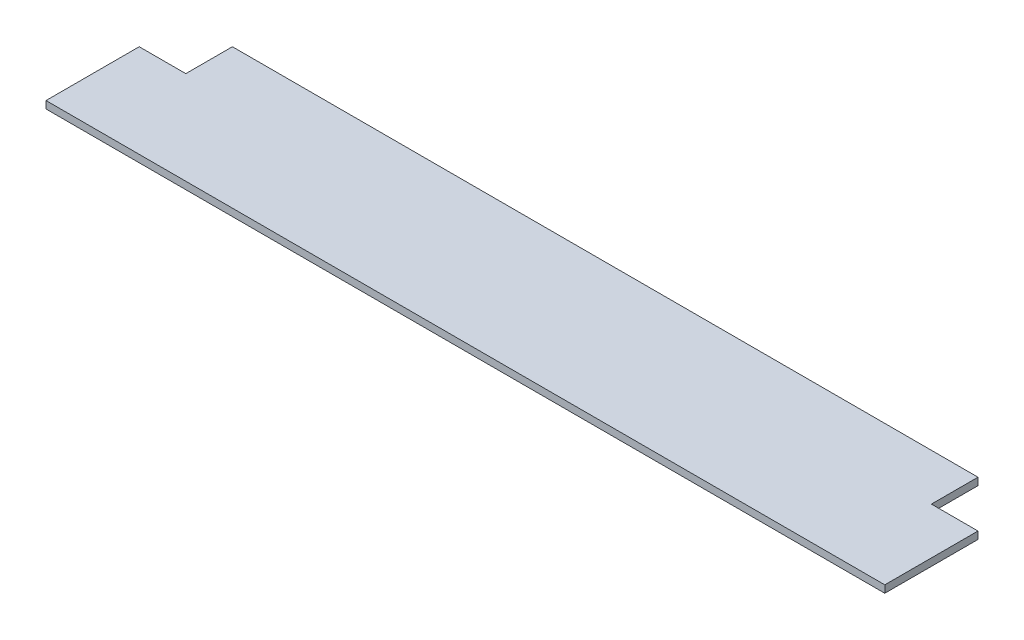
ISO-10303-21;
HEADER;
FILE_DESCRIPTION(('STEP AP214'),'2;1');
FILE_NAME('part.step','',(''),(''),'','','');
FILE_SCHEMA(('AUTOMOTIVE_DESIGN { 1 0 10303 214 1 1 1 1 }'));
ENDSEC;
DATA;
#1=APPLICATION_CONTEXT('core data for automotive mechanical design processes');
#2=APPLICATION_PROTOCOL_DEFINITION('international standard','automotive_design',2000,#1);
#3=PRODUCT_CONTEXT('',#1,'mechanical');
#4=PRODUCT('Part','Part','',(#3));
#5=PRODUCT_RELATED_PRODUCT_CATEGORY('part','',(#4));
#6=PRODUCT_DEFINITION_FORMATION('','',#4);
#7=PRODUCT_DEFINITION_CONTEXT('part definition',#1,'design');
#8=PRODUCT_DEFINITION('design','',#6,#7);
#9=PRODUCT_DEFINITION_SHAPE('','',#8);
#10=(LENGTH_UNIT() NAMED_UNIT(*) SI_UNIT(.MILLI.,.METRE.));
#11=(NAMED_UNIT(*) PLANE_ANGLE_UNIT() SI_UNIT($,.RADIAN.));
#12=(NAMED_UNIT(*) SI_UNIT($,.STERADIAN.) SOLID_ANGLE_UNIT());
#13=UNCERTAINTY_MEASURE_WITH_UNIT(LENGTH_MEASURE(1.E-05),#10,'distance_accuracy_value','');
#14=(GEOMETRIC_REPRESENTATION_CONTEXT(3) GLOBAL_UNCERTAINTY_ASSIGNED_CONTEXT((#13)) GLOBAL_UNIT_ASSIGNED_CONTEXT((#10,
#11,#12)) REPRESENTATION_CONTEXT('',''));
#15=CARTESIAN_POINT('',(0.,0.,0.));
#16=DIRECTION('',(0.,0.,1.));
#17=DIRECTION('',(1.,0.,0.));
#18=AXIS2_PLACEMENT_3D('',#15,#16,#17);
#19=CARTESIAN_POINT('',(50.8,1.,-6.35));
#20=DIRECTION('',(0.,0.,1.));
#21=DIRECTION('',(1.,0.,0.));
#22=AXIS2_PLACEMENT_3D('',#19,#20,#21);
#23=PLANE('',#22);
#24=DIRECTION('',(-1.,0.,0.));
#25=VECTOR('',#24,1.);
#26=CARTESIAN_POINT('',(50.8,0.,-6.35));
#27=LINE('',#26,#25);
#28=CARTESIAN_POINT('',(57.15,0.,-6.35));
#29=VERTEX_POINT('',#28);
#30=CARTESIAN_POINT('',(50.8,0.,-6.35));
#31=VERTEX_POINT('',#30);
#32=EDGE_CURVE('E135',#29,#31,#27,.T.);
#33=ORIENTED_EDGE('',*,*,#32,.T.);
#34=DIRECTION('',(0.,-1.,0.));
#35=VECTOR('',#34,1.);
#36=CARTESIAN_POINT('',(50.8,1.,-6.35));
#37=LINE('',#36,#35);
#38=CARTESIAN_POINT('',(50.8,1.,-6.35));
#39=VERTEX_POINT('',#38);
#40=EDGE_CURVE('E11',#39,#31,#37,.T.);
#41=ORIENTED_EDGE('',*,*,#40,.F.);
#42=DIRECTION('',(-1.,0.,0.));
#43=VECTOR('',#42,1.);
#44=CARTESIAN_POINT('',(50.8,1.,-6.35));
#45=LINE('',#44,#43);
#46=CARTESIAN_POINT('',(57.15,1.,-6.35));
#47=VERTEX_POINT('',#46);
#48=EDGE_CURVE('E149',#47,#39,#45,.T.);
#49=ORIENTED_EDGE('',*,*,#48,.F.);
#50=DIRECTION('',(0.,-1.,0.));
#51=VECTOR('',#50,1.);
#52=CARTESIAN_POINT('',(57.15,1.,-6.35));
#53=LINE('',#52,#51);
#54=EDGE_CURVE('E131',#47,#29,#53,.T.);
#55=ORIENTED_EDGE('',*,*,#54,.T.);
#56=EDGE_LOOP('',(#33,#41,#49,#55));
#57=FACE_BOUND('',#56,.T.);
#58=ADVANCED_FACE('F39',(#57),#23,.F.);
#59=CARTESIAN_POINT('',(50.8,1.,-12.7));
#60=DIRECTION('',(-1.,0.,0.));
#61=DIRECTION('',(0.,0.,1.));
#62=AXIS2_PLACEMENT_3D('',#59,#60,#61);
#63=PLANE('',#62);
#64=DIRECTION('',(0.,0.,-1.));
#65=VECTOR('',#64,1.);
#66=CARTESIAN_POINT('',(50.8,0.,-12.7));
#67=LINE('',#66,#65);
#68=CARTESIAN_POINT('',(50.8,0.,-12.7));
#69=VERTEX_POINT('',#68);
#70=EDGE_CURVE('E138',#31,#69,#67,.T.);
#71=ORIENTED_EDGE('',*,*,#70,.T.);
#72=DIRECTION('',(0.,-1.,0.));
#73=VECTOR('',#72,1.);
#74=CARTESIAN_POINT('',(50.8,1.,-12.7));
#75=LINE('',#74,#73);
#76=CARTESIAN_POINT('',(50.8,1.,-12.7));
#77=VERTEX_POINT('',#76);
#78=EDGE_CURVE('E47',#77,#69,#75,.T.);
#79=ORIENTED_EDGE('',*,*,#78,.F.);
#80=DIRECTION('',(0.,0.,-1.));
#81=VECTOR('',#80,1.);
#82=CARTESIAN_POINT('',(50.8,1.,-12.7));
#83=LINE('',#82,#81);
#84=EDGE_CURVE('E98',#39,#77,#83,.T.);
#85=ORIENTED_EDGE('',*,*,#84,.F.);
#86=ORIENTED_EDGE('',*,*,#40,.T.);
#87=EDGE_LOOP('',(#71,#79,#85,#86));
#88=FACE_BOUND('',#87,.T.);
#89=ADVANCED_FACE('F184',(#88),#63,.F.);
#90=CARTESIAN_POINT('',(-50.8,1.,-12.7));
#91=DIRECTION('',(0.,0.,1.));
#92=DIRECTION('',(1.,0.,0.));
#93=AXIS2_PLACEMENT_3D('',#90,#91,#92);
#94=PLANE('',#93);
#95=DIRECTION('',(-1.,0.,0.));
#96=VECTOR('',#95,1.);
#97=CARTESIAN_POINT('',(-50.8,0.,-12.7));
#98=LINE('',#97,#96);
#99=CARTESIAN_POINT('',(-50.8,0.,-12.7));
#100=VERTEX_POINT('',#99);
#101=EDGE_CURVE('E140',#69,#100,#98,.T.);
#102=ORIENTED_EDGE('',*,*,#101,.T.);
#103=DIRECTION('',(0.,-1.,0.));
#104=VECTOR('',#103,1.);
#105=CARTESIAN_POINT('',(-50.8,1.,-12.7));
#106=LINE('',#105,#104);
#107=CARTESIAN_POINT('',(-50.8,1.,-12.7));
#108=VERTEX_POINT('',#107);
#109=EDGE_CURVE('E156',#108,#100,#106,.T.);
#110=ORIENTED_EDGE('',*,*,#109,.F.);
#111=DIRECTION('',(-1.,0.,0.));
#112=VECTOR('',#111,1.);
#113=CARTESIAN_POINT('',(-50.8,1.,-12.7));
#114=LINE('',#113,#112);
#115=EDGE_CURVE('E164',#77,#108,#114,.T.);
#116=ORIENTED_EDGE('',*,*,#115,.F.);
#117=ORIENTED_EDGE('',*,*,#78,.T.);
#118=EDGE_LOOP('',(#102,#110,#116,#117));
#119=FACE_BOUND('',#118,.T.);
#120=ADVANCED_FACE('F162',(#119),#94,.F.);
#121=CARTESIAN_POINT('',(-50.8,1.,-6.35));
#122=DIRECTION('',(1.,0.,0.));
#123=DIRECTION('',(0.,0.,-1.));
#124=AXIS2_PLACEMENT_3D('',#121,#122,#123);
#125=PLANE('',#124);
#126=DIRECTION('',(0.,0.,1.));
#127=VECTOR('',#126,1.);
#128=CARTESIAN_POINT('',(-50.8,0.,-6.35));
#129=LINE('',#128,#127);
#130=CARTESIAN_POINT('',(-50.8,0.,-6.35));
#131=VERTEX_POINT('',#130);
#132=EDGE_CURVE('E142',#100,#131,#129,.T.);
#133=ORIENTED_EDGE('',*,*,#132,.T.);
#134=DIRECTION('',(0.,-1.,0.));
#135=VECTOR('',#134,1.);
#136=CARTESIAN_POINT('',(-50.8,1.,-6.35));
#137=LINE('',#136,#135);
#138=CARTESIAN_POINT('',(-50.8,1.,-6.35));
#139=VERTEX_POINT('',#138);
#140=EDGE_CURVE('E153',#139,#131,#137,.T.);
#141=ORIENTED_EDGE('',*,*,#140,.F.);
#142=DIRECTION('',(0.,0.,1.));
#143=VECTOR('',#142,1.);
#144=CARTESIAN_POINT('',(-50.8,1.,-6.35));
#145=LINE('',#144,#143);
#146=EDGE_CURVE('E176',#108,#139,#145,.T.);
#147=ORIENTED_EDGE('',*,*,#146,.F.);
#148=ORIENTED_EDGE('',*,*,#109,.T.);
#149=EDGE_LOOP('',(#133,#141,#147,#148));
#150=FACE_BOUND('',#149,.T.);
#151=ADVANCED_FACE('F172',(#150),#125,.F.);
#152=CARTESIAN_POINT('',(-57.15,1.,-6.35));
#153=DIRECTION('',(0.,0.,1.));
#154=DIRECTION('',(1.,0.,0.));
#155=AXIS2_PLACEMENT_3D('',#152,#153,#154);
#156=PLANE('',#155);
#157=DIRECTION('',(-1.,0.,0.));
#158=VECTOR('',#157,1.);
#159=CARTESIAN_POINT('',(-57.15,0.,-6.35));
#160=LINE('',#159,#158);
#161=CARTESIAN_POINT('',(-57.15,0.,-6.35));
#162=VERTEX_POINT('',#161);
#163=EDGE_CURVE('E144',#131,#162,#160,.T.);
#164=ORIENTED_EDGE('',*,*,#163,.T.);
#165=DIRECTION('',(0.,-1.,0.));
#166=VECTOR('',#165,1.);
#167=CARTESIAN_POINT('',(-57.15,1.,-6.35));
#168=LINE('',#167,#166);
#169=CARTESIAN_POINT('',(-57.15,1.,-6.35));
#170=VERTEX_POINT('',#169);
#171=EDGE_CURVE('E126',#170,#162,#168,.T.);
#172=ORIENTED_EDGE('',*,*,#171,.F.);
#173=DIRECTION('',(-1.,0.,0.));
#174=VECTOR('',#173,1.);
#175=CARTESIAN_POINT('',(-57.15,1.,-6.35));
#176=LINE('',#175,#174);
#177=EDGE_CURVE('E117',#139,#170,#176,.T.);
#178=ORIENTED_EDGE('',*,*,#177,.F.);
#179=ORIENTED_EDGE('',*,*,#140,.T.);
#180=EDGE_LOOP('',(#164,#172,#178,#179));
#181=FACE_BOUND('',#180,.T.);
#182=ADVANCED_FACE('F175',(#181),#156,.F.);
#183=CARTESIAN_POINT('',(-57.15,1.,6.35));
#184=DIRECTION('',(1.,0.,0.));
#185=DIRECTION('',(0.,0.,-1.));
#186=AXIS2_PLACEMENT_3D('',#183,#184,#185);
#187=PLANE('',#186);
#188=DIRECTION('',(0.,0.,1.));
#189=VECTOR('',#188,1.);
#190=CARTESIAN_POINT('',(-57.15,0.,6.35));
#191=LINE('',#190,#189);
#192=CARTESIAN_POINT('',(-57.15,0.,6.35));
#193=VERTEX_POINT('',#192);
#194=EDGE_CURVE('E125',#162,#193,#191,.T.);
#195=ORIENTED_EDGE('',*,*,#194,.T.);
#196=DIRECTION('',(0.,-1.,0.));
#197=VECTOR('',#196,1.);
#198=CARTESIAN_POINT('',(-57.15,1.,6.35));
#199=LINE('',#198,#197);
#200=CARTESIAN_POINT('',(-57.15,1.,6.35));
#201=VERTEX_POINT('',#200);
#202=EDGE_CURVE('E122',#201,#193,#199,.T.);
#203=ORIENTED_EDGE('',*,*,#202,.F.);
#204=DIRECTION('',(0.,0.,1.));
#205=VECTOR('',#204,1.);
#206=CARTESIAN_POINT('',(-57.15,1.,6.35));
#207=LINE('',#206,#205);
#208=EDGE_CURVE('E111',#170,#201,#207,.T.);
#209=ORIENTED_EDGE('',*,*,#208,.F.);
#210=ORIENTED_EDGE('',*,*,#171,.T.);
#211=EDGE_LOOP('',(#195,#203,#209,#210));
#212=FACE_BOUND('',#211,.T.);
#213=ADVANCED_FACE('F123',(#212),#187,.F.);
#214=CARTESIAN_POINT('',(-57.15,1.,6.35));
#215=DIRECTION('',(0.,0.,-1.));
#216=DIRECTION('',(-1.,0.,0.));
#217=AXIS2_PLACEMENT_3D('',#214,#215,#216);
#218=PLANE('',#217);
#219=DIRECTION('',(1.,0.,0.));
#220=VECTOR('',#219,1.);
#221=CARTESIAN_POINT('',(-57.15,0.,6.35));
#222=LINE('',#221,#220);
#223=CARTESIAN_POINT('',(57.15,0.,6.35));
#224=VERTEX_POINT('',#223);
#225=EDGE_CURVE('E84',#193,#224,#222,.T.);
#226=ORIENTED_EDGE('',*,*,#225,.T.);
#227=DIRECTION('',(0.,-1.,0.));
#228=VECTOR('',#227,1.);
#229=CARTESIAN_POINT('',(57.15,1.,6.35));
#230=LINE('',#229,#228);
#231=CARTESIAN_POINT('',(57.15,1.,6.35));
#232=VERTEX_POINT('',#231);
#233=EDGE_CURVE('E127',#232,#224,#230,.T.);
#234=ORIENTED_EDGE('',*,*,#233,.F.);
#235=DIRECTION('',(1.,0.,0.));
#236=VECTOR('',#235,1.);
#237=CARTESIAN_POINT('',(-57.15,1.,6.35));
#238=LINE('',#237,#236);
#239=EDGE_CURVE('E115',#201,#232,#238,.T.);
#240=ORIENTED_EDGE('',*,*,#239,.F.);
#241=ORIENTED_EDGE('',*,*,#202,.T.);
#242=EDGE_LOOP('',(#226,#234,#240,#241));
#243=FACE_BOUND('',#242,.T.);
#244=ADVANCED_FACE('F129',(#243),#218,.F.);
#245=CARTESIAN_POINT('',(57.15,1.,6.35));
#246=DIRECTION('',(-1.,0.,0.));
#247=DIRECTION('',(0.,0.,1.));
#248=AXIS2_PLACEMENT_3D('',#245,#246,#247);
#249=PLANE('',#248);
#250=DIRECTION('',(0.,0.,-1.));
#251=VECTOR('',#250,1.);
#252=CARTESIAN_POINT('',(57.15,0.,6.35));
#253=LINE('',#252,#251);
#254=EDGE_CURVE('E90',#224,#29,#253,.T.);
#255=ORIENTED_EDGE('',*,*,#254,.T.);
#256=ORIENTED_EDGE('',*,*,#54,.F.);
#257=DIRECTION('',(0.,0.,-1.));
#258=VECTOR('',#257,1.);
#259=CARTESIAN_POINT('',(57.15,1.,6.35));
#260=LINE('',#259,#258);
#261=EDGE_CURVE('E55',#232,#47,#260,.T.);
#262=ORIENTED_EDGE('',*,*,#261,.F.);
#263=ORIENTED_EDGE('',*,*,#233,.T.);
#264=EDGE_LOOP('',(#255,#256,#262,#263));
#265=FACE_BOUND('',#264,.T.);
#266=ADVANCED_FACE('F200',(#265),#249,.F.);
#267=CARTESIAN_POINT('',(0.,1.,0.));
#268=DIRECTION('',(0.,1.,0.));
#269=DIRECTION('',(0.,0.,1.));
#270=AXIS2_PLACEMENT_3D('',#267,#268,#269);
#271=PLANE('',#270);
#272=ORIENTED_EDGE('',*,*,#48,.T.);
#273=ORIENTED_EDGE('',*,*,#84,.T.);
#274=ORIENTED_EDGE('',*,*,#115,.T.);
#275=ORIENTED_EDGE('',*,*,#146,.T.);
#276=ORIENTED_EDGE('',*,*,#177,.T.);
#277=ORIENTED_EDGE('',*,*,#208,.T.);
#278=ORIENTED_EDGE('',*,*,#239,.T.);
#279=ORIENTED_EDGE('',*,*,#261,.T.);
#280=EDGE_LOOP('',(#272,#273,#274,#275,#276,#277,#278,#279));
#281=FACE_BOUND('',#280,.T.);
#282=ADVANCED_FACE('F113',(#281),#271,.T.);
#283=CARTESIAN_POINT('',(0.,0.,0.));
#284=DIRECTION('',(0.,1.,0.));
#285=DIRECTION('',(0.,0.,1.));
#286=AXIS2_PLACEMENT_3D('',#283,#284,#285);
#287=PLANE('',#286);
#288=ORIENTED_EDGE('',*,*,#32,.F.);
#289=ORIENTED_EDGE('',*,*,#254,.F.);
#290=ORIENTED_EDGE('',*,*,#225,.F.);
#291=ORIENTED_EDGE('',*,*,#194,.F.);
#292=ORIENTED_EDGE('',*,*,#163,.F.);
#293=ORIENTED_EDGE('',*,*,#132,.F.);
#294=ORIENTED_EDGE('',*,*,#101,.F.);
#295=ORIENTED_EDGE('',*,*,#70,.F.);
#296=EDGE_LOOP('',(#288,#289,#290,#291,#292,#293,#294,#295));
#297=FACE_BOUND('',#296,.T.);
#298=ADVANCED_FACE('F168',(#297),#287,.F.);
#299=CLOSED_SHELL('',(#58,#89,#120,#151,#182,#213,#244,#266,#282,#298));
#300=MANIFOLD_SOLID_BREP('B2',#299);
#301=ADVANCED_BREP_SHAPE_REPRESENTATION('',(#18,#300),#14);
#302=SHAPE_DEFINITION_REPRESENTATION(#9,#301);
ENDSEC;
END-ISO-10303-21;
